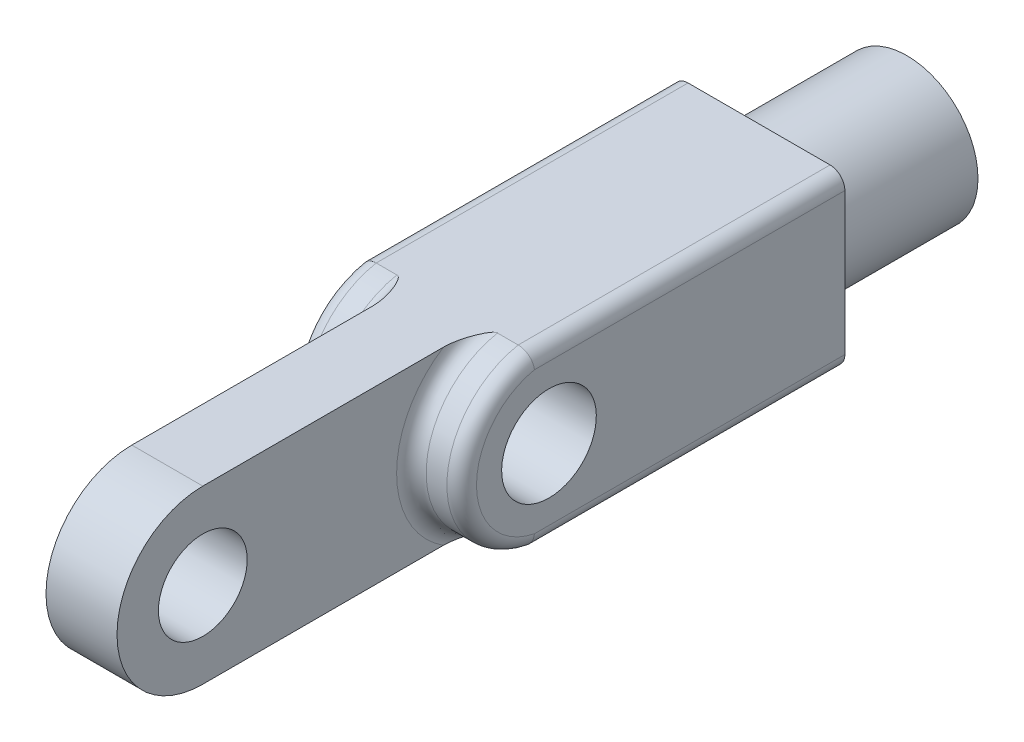
ISO-10303-21;
HEADER;
FILE_DESCRIPTION(('STEP AP214'),'2;1');
FILE_NAME('part.step','',(''),(''),'','','');
FILE_SCHEMA(('AUTOMOTIVE_DESIGN { 1 0 10303 214 1 1 1 1 }'));
ENDSEC;
DATA;
#1=APPLICATION_CONTEXT('core data for automotive mechanical design processes');
#2=APPLICATION_PROTOCOL_DEFINITION('international standard','automotive_design',2000,#1);
#3=PRODUCT_CONTEXT('',#1,'mechanical');
#4=PRODUCT('Part','Part','',(#3));
#5=PRODUCT_RELATED_PRODUCT_CATEGORY('part','',(#4));
#6=PRODUCT_DEFINITION_FORMATION('','',#4);
#7=PRODUCT_DEFINITION_CONTEXT('part definition',#1,'design');
#8=PRODUCT_DEFINITION('design','',#6,#7);
#9=PRODUCT_DEFINITION_SHAPE('','',#8);
#10=(LENGTH_UNIT() NAMED_UNIT(*) SI_UNIT(.MILLI.,.METRE.));
#11=(NAMED_UNIT(*) PLANE_ANGLE_UNIT() SI_UNIT($,.RADIAN.));
#12=(NAMED_UNIT(*) SI_UNIT($,.STERADIAN.) SOLID_ANGLE_UNIT());
#13=UNCERTAINTY_MEASURE_WITH_UNIT(LENGTH_MEASURE(1.E-05),#10,'distance_accuracy_value','');
#14=(GEOMETRIC_REPRESENTATION_CONTEXT(3) GLOBAL_UNCERTAINTY_ASSIGNED_CONTEXT((#13)) GLOBAL_UNIT_ASSIGNED_CONTEXT((#10,
#11,#12)) REPRESENTATION_CONTEXT('',''));
#15=CARTESIAN_POINT('',(0.,0.,0.));
#16=DIRECTION('',(0.,0.,1.));
#17=DIRECTION('',(1.,0.,0.));
#18=AXIS2_PLACEMENT_3D('',#15,#16,#17);
#19=CARTESIAN_POINT('',(2.9,-2.9,33.));
#20=DIRECTION('',(-1.,0.,0.));
#21=DIRECTION('',(0.,-1.,0.));
#22=AXIS2_PLACEMENT_3D('',#19,#20,#21);
#23=PLANE('',#22);
#24=CARTESIAN_POINT('',(2.9,0.,15.));
#25=DIRECTION('',(-1.,0.,0.));
#26=DIRECTION('',(0.,-1.,0.));
#27=AXIS2_PLACEMENT_3D('',#24,#25,#26);
#28=CIRCLE('',#27,1.6);
#29=CARTESIAN_POINT('',(2.9,-1.6,15.));
#30=VERTEX_POINT('',#29);
#31=EDGE_CURVE('E190',#30,#30,#28,.T.);
#32=ORIENTED_EDGE('',*,*,#31,.T.);
#33=EDGE_LOOP('',(#32));
#34=FACE_BOUND('',#33,.T.);
#35=DIRECTION('',(0.,1.,0.));
#36=VECTOR('',#35,1.);
#37=CARTESIAN_POINT('',(2.9,-2.9,5.));
#38=LINE('',#37,#36);
#39=CARTESIAN_POINT('',(2.9,-2.4,5.));
#40=VERTEX_POINT('',#39);
#41=CARTESIAN_POINT('',(2.9,2.4,5.));
#42=VERTEX_POINT('',#41);
#43=EDGE_CURVE('E199',#40,#42,#38,.T.);
#44=ORIENTED_EDGE('',*,*,#43,.T.);
#45=DIRECTION('',(0.,0.,-1.));
#46=VECTOR('',#45,1.);
#47=CARTESIAN_POINT('',(2.9,2.4,33.));
#48=LINE('',#47,#46);
#49=CARTESIAN_POINT('',(2.9,2.39999999999604,15.4924428901091));
#50=VERTEX_POINT('',#49);
#51=EDGE_CURVE('E219',#42,#50,#48,.F.);
#52=ORIENTED_EDGE('',*,*,#51,.T.);
#53=CARTESIAN_POINT('',(2.9,0.,15.));
#54=DIRECTION('',(-1.,0.,0.));
#55=DIRECTION('',(0.,-1.,0.));
#56=AXIS2_PLACEMENT_3D('',#53,#54,#55);
#57=CIRCLE('',#56,2.45);
#58=CARTESIAN_POINT('',(2.9,-2.4,15.4924428901091));
#59=VERTEX_POINT('',#58);
#60=EDGE_CURVE('E217',#50,#59,#57,.F.);
#61=ORIENTED_EDGE('',*,*,#60,.T.);
#62=DIRECTION('',(0.,0.,-1.));
#63=VECTOR('',#62,1.);
#64=CARTESIAN_POINT('',(2.9,-2.4,33.));
#65=LINE('',#64,#63);
#66=EDGE_CURVE('E215',#59,#40,#65,.T.);
#67=ORIENTED_EDGE('',*,*,#66,.T.);
#68=EDGE_LOOP('',(#44,#52,#61,#67));
#69=FACE_BOUND('',#68,.T.);
#70=ADVANCED_FACE('F36',(#34,#69),#23,.F.);
#71=CARTESIAN_POINT('',(-2.9,2.9,33.));
#72=DIRECTION('',(1.,0.,0.));
#73=DIRECTION('',(0.,1.,0.));
#74=AXIS2_PLACEMENT_3D('',#71,#72,#73);
#75=PLANE('',#74);
#76=CARTESIAN_POINT('',(-2.9,0.,15.));
#77=DIRECTION('',(-1.,0.,0.));
#78=DIRECTION('',(0.,-1.,0.));
#79=AXIS2_PLACEMENT_3D('',#76,#77,#78);
#80=CIRCLE('',#79,1.6);
#81=CARTESIAN_POINT('',(-2.9,-1.6,15.));
#82=VERTEX_POINT('',#81);
#83=EDGE_CURVE('E184',#82,#82,#80,.T.);
#84=ORIENTED_EDGE('',*,*,#83,.F.);
#85=EDGE_LOOP('',(#84));
#86=FACE_BOUND('',#85,.T.);
#87=CARTESIAN_POINT('',(-2.9,0.,15.));
#88=DIRECTION('',(1.,0.,0.));
#89=DIRECTION('',(0.,1.,0.));
#90=AXIS2_PLACEMENT_3D('',#87,#88,#89);
#91=CIRCLE('',#90,2.45);
#92=CARTESIAN_POINT('',(-2.9,-2.4,15.4924428901091));
#93=VERTEX_POINT('',#92);
#94=CARTESIAN_POINT('',(-2.9,2.39999999999604,15.4924428901091));
#95=VERTEX_POINT('',#94);
#96=EDGE_CURVE('E228',#93,#95,#91,.F.);
#97=ORIENTED_EDGE('',*,*,#96,.T.);
#98=DIRECTION('',(0.,0.,-1.));
#99=VECTOR('',#98,1.);
#100=CARTESIAN_POINT('',(-2.9,2.4,33.));
#101=LINE('',#100,#99);
#102=CARTESIAN_POINT('',(-2.9,2.4,5.));
#103=VERTEX_POINT('',#102);
#104=EDGE_CURVE('E230',#95,#103,#101,.T.);
#105=ORIENTED_EDGE('',*,*,#104,.T.);
#106=DIRECTION('',(0.,-1.,0.));
#107=VECTOR('',#106,1.);
#108=CARTESIAN_POINT('',(-2.9,2.9,5.));
#109=LINE('',#108,#107);
#110=CARTESIAN_POINT('',(-2.9,-2.4,5.));
#111=VERTEX_POINT('',#110);
#112=EDGE_CURVE('E194',#103,#111,#109,.T.);
#113=ORIENTED_EDGE('',*,*,#112,.T.);
#114=DIRECTION('',(0.,0.,-1.));
#115=VECTOR('',#114,1.);
#116=CARTESIAN_POINT('',(-2.9,-2.4,33.));
#117=LINE('',#116,#115);
#118=EDGE_CURVE('E226',#111,#93,#117,.F.);
#119=ORIENTED_EDGE('',*,*,#118,.T.);
#120=EDGE_LOOP('',(#97,#105,#113,#119));
#121=FACE_BOUND('',#120,.T.);
#122=ADVANCED_FACE('F323',(#86,#121),#75,.F.);
#123=CARTESIAN_POINT('',(-2.9,-2.9,33.));
#124=DIRECTION('',(0.,1.,0.));
#125=DIRECTION('',(-1.,0.,0.));
#126=AXIS2_PLACEMENT_3D('',#123,#124,#125);
#127=PLANE('',#126);
#128=DIRECTION('',(-1.,0.,0.));
#129=VECTOR('',#128,1.);
#130=CARTESIAN_POINT('',(5.09980188990753,-2.9,15.5408326913196));
#131=LINE('',#130,#129);
#132=CARTESIAN_POINT('',(-1.7,-2.9,15.5408326913196));
#133=VERTEX_POINT('',#132);
#134=CARTESIAN_POINT('',(-2.4,-2.9,15.5408326913196));
#135=VERTEX_POINT('',#134);
#136=EDGE_CURVE('E168',#133,#135,#131,.T.);
#137=ORIENTED_EDGE('',*,*,#136,.T.);
#138=DIRECTION('',(0.,0.,-1.));
#139=VECTOR('',#138,1.);
#140=CARTESIAN_POINT('',(-2.4,-2.9,33.));
#141=LINE('',#140,#139);
#142=CARTESIAN_POINT('',(-2.4,-2.9,5.));
#143=VERTEX_POINT('',#142);
#144=EDGE_CURVE('E67',#135,#143,#141,.T.);
#145=ORIENTED_EDGE('',*,*,#144,.T.);
#146=DIRECTION('',(1.,0.,0.));
#147=VECTOR('',#146,1.);
#148=CARTESIAN_POINT('',(-2.9,-2.9,5.));
#149=LINE('',#148,#147);
#150=CARTESIAN_POINT('',(2.4,-2.9,5.));
#151=VERTEX_POINT('',#150);
#152=EDGE_CURVE('E197',#143,#151,#149,.T.);
#153=ORIENTED_EDGE('',*,*,#152,.T.);
#154=DIRECTION('',(0.,0.,-1.));
#155=VECTOR('',#154,1.);
#156=CARTESIAN_POINT('',(2.4,-2.9,33.));
#157=LINE('',#156,#155);
#158=CARTESIAN_POINT('',(2.4,-2.9,15.5408326913196));
#159=VERTEX_POINT('',#158);
#160=EDGE_CURVE('E247',#151,#159,#157,.F.);
#161=ORIENTED_EDGE('',*,*,#160,.T.);
#162=DIRECTION('',(1.,0.,0.));
#163=VECTOR('',#162,1.);
#164=CARTESIAN_POINT('',(-5.09980188990753,-2.9,15.5408326913196));
#165=LINE('',#164,#163);
#166=CARTESIAN_POINT('',(1.7,-2.9,15.5408326913196));
#167=VERTEX_POINT('',#166);
#168=EDGE_CURVE('E300',#167,#159,#165,.T.);
#169=ORIENTED_EDGE('',*,*,#168,.F.);
#170=CARTESIAN_POINT('',(1.7,-2.9,15.5408326913196));
#171=CARTESIAN_POINT('',(1.69412480353315,-2.9,15.5408123998312));
#172=CARTESIAN_POINT('',(1.68827959778841,-2.9,15.5413967130348));
#173=CARTESIAN_POINT('',(1.67687295949634,-2.9,15.5435765291781));
#174=CARTESIAN_POINT('',(1.67130848875001,-2.9,15.5451557650231));
#175=CARTESIAN_POINT('',(1.65853087706052,-2.9,15.5498602747289));
#176=CARTESIAN_POINT('',(1.65145133483265,-2.9,15.5533384718661));
#177=CARTESIAN_POINT('',(1.63787459129956,-2.9,15.5613489450848));
#178=CARTESIAN_POINT('',(1.63138212101824,-2.9,15.5658888804982));
#179=CARTESIAN_POINT('',(1.6093968992353,-2.9,15.5830942904758));
#180=CARTESIAN_POINT('',(1.59534911027011,-2.9,15.597555191198));
#181=CARTESIAN_POINT('',(1.5692510588943,-2.9,15.6281635176408));
#182=CARTESIAN_POINT('',(1.55721456480454,-2.9,15.6443214258177));
#183=CARTESIAN_POINT('',(1.53470657491081,-2.9,15.6771578924549));
#184=CARTESIAN_POINT('',(1.52420562538351,-2.9,15.6938161448804));
#185=CARTESIAN_POINT('',(1.50408782173422,-2.9,15.7276621034289));
#186=CARTESIAN_POINT('',(1.49447165105841,-2.9,15.7448502053769));
#187=CARTESIAN_POINT('',(1.46658955764737,-2.9,15.7970164994017));
#188=CARTESIAN_POINT('',(1.44933095909224,-2.9,15.8325325368809));
#189=CARTESIAN_POINT('',(1.41667201070383,-2.9,15.9044578458938));
#190=CARTESIAN_POINT('',(1.4012746961101,-2.9,15.9408684629534));
#191=CARTESIAN_POINT('',(1.37210686809767,-2.9,16.0142907842692));
#192=CARTESIAN_POINT('',(1.35833473275119,-2.9,16.0513018465819));
#193=CARTESIAN_POINT('',(1.32320985813169,-2.9,16.1518801031893));
#194=CARTESIAN_POINT('',(1.30327688025274,-2.9,16.2159489878795));
#195=CARTESIAN_POINT('',(1.26798365493884,-2.9,16.3453462421695));
#196=CARTESIAN_POINT('',(1.25262412335833,-2.9,16.4106748072375));
#197=CARTESIAN_POINT('',(1.22744288173741,-2.9,16.5411169796033));
#198=CARTESIAN_POINT('',(1.21751987012134,-2.9,16.6062103346319));
#199=CARTESIAN_POINT('',(1.20723237351085,-2.9,16.7043629465234));
#200=CARTESIAN_POINT('',(1.20456916076688,-2.9,16.7371859339091));
#201=CARTESIAN_POINT('',(1.20095486025429,-2.9,16.8029424164482));
#202=CARTESIAN_POINT('',(1.20000470261831,-2.9,16.8358759619147));
#203=CARTESIAN_POINT('',(1.2,-2.9,16.8688231591031));
#204=B_SPLINE_CURVE_WITH_KNOTS('',3,(#170,#171,#172,#173,#174,#175,#176,#177,#178,#179,#180,
#181,#182,#183,#184,#185,#186,#187,#188,#189,#190,#191,#192,#193,#194,#195,#196,#197,#198,#199,
#200,#201,#202,#203),.UNSPECIFIED.,.F.,.F.,(4,2,2,2,2,2,2,2,2,2,2,2,2,2,2,2,4),(0.,
0.0175484885264491,0.0348172496168289,0.0583461930485622,0.0820504151958283,0.142059514112138,
0.202463923206587,0.261489398370771,0.320560091481372,0.438929011061277,0.557488425624699,
0.675928498953394,0.877051779021754,1.07820652319581,1.27547316760538,1.37422609435937,
1.47303262457768),.UNSPECIFIED.);
#205=CARTESIAN_POINT('',(1.2,-2.9,16.8688231591031));
#206=VERTEX_POINT('',#205);
#207=EDGE_CURVE('E11',#167,#206,#204,.T.);
#208=ORIENTED_EDGE('',*,*,#207,.T.);
#209=DIRECTION('',(0.,0.,1.));
#210=VECTOR('',#209,1.);
#211=CARTESIAN_POINT('',(1.2,-2.9,18.));
#212=LINE('',#211,#210);
#213=CARTESIAN_POINT('',(1.2,-2.9,25.));
#214=VERTEX_POINT('',#213);
#215=EDGE_CURVE('E157',#206,#214,#212,.T.);
#216=ORIENTED_EDGE('',*,*,#215,.T.);
#217=DIRECTION('',(-1.,0.,0.));
#218=VECTOR('',#217,1.);
#219=CARTESIAN_POINT('',(4.8,-2.9,25.));
#220=LINE('',#219,#218);
#221=CARTESIAN_POINT('',(-1.2,-2.9,25.));
#222=VERTEX_POINT('',#221);
#223=EDGE_CURVE('E164',#214,#222,#220,.T.);
#224=ORIENTED_EDGE('',*,*,#223,.T.);
#225=DIRECTION('',(0.,0.,1.));
#226=VECTOR('',#225,1.);
#227=CARTESIAN_POINT('',(-1.2,-2.9,18.));
#228=LINE('',#227,#226);
#229=CARTESIAN_POINT('',(-1.2,-2.9,16.8688231591031));
#230=VERTEX_POINT('',#229);
#231=EDGE_CURVE('E148',#230,#222,#228,.T.);
#232=ORIENTED_EDGE('',*,*,#231,.F.);
#233=CARTESIAN_POINT('',(-1.2,-2.9,16.8688231591031));
#234=CARTESIAN_POINT('',(-1.20000350633321,-2.9,16.8383114685506));
#235=CARTESIAN_POINT('',(-1.20081900974739,-2.9,16.8078103310561));
#236=CARTESIAN_POINT('',(-1.20393155246536,-2.9,16.7468963893262));
#237=CARTESIAN_POINT('',(-1.20622792431202,-2.9,16.7164835514926));
#238=CARTESIAN_POINT('',(-1.21511676156129,-2.9,16.6255319894845));
#239=CARTESIAN_POINT('',(-1.22370985461081,-2.9,16.5651844330548));
#240=CARTESIAN_POINT('',(-1.24532565481087,-2.9,16.4455946212641));
#241=CARTESIAN_POINT('',(-1.25832843113131,-2.9,16.3863486361891));
#242=CARTESIAN_POINT('',(-1.2881945004449,-2.9,16.2688307121859));
#243=CARTESIAN_POINT('',(-1.30505841144115,-2.9,16.21055893079));
#244=CARTESIAN_POINT('',(-1.33616838302538,-2.9,16.1143138929974));
#245=CARTESIAN_POINT('',(-1.34942774380135,-2.9,16.0760180856955));
#246=CARTESIAN_POINT('',(-1.37757918542265,-2.9,16.0000183022054));
#247=CARTESIAN_POINT('',(-1.39247171569656,-2.9,15.9623144922074));
#248=CARTESIAN_POINT('',(-1.43007136225979,-2.9,15.8733510625648));
#249=CARTESIAN_POINT('',(-1.45358760937016,-2.9,15.8224272524231));
#250=CARTESIAN_POINT('',(-1.49743401159934,-2.9,15.7387381757962));
#251=CARTESIAN_POINT('',(-1.51643227194485,-2.9,15.7053084151003));
#252=CARTESIAN_POINT('',(-1.54812107208784,-2.9,15.6572162375816));
#253=CARTESIAN_POINT('',(-1.55922491525228,-2.9,15.6415171869075));
#254=CARTESIAN_POINT('',(-1.58304930975357,-2.9,15.6113865379193));
#255=CARTESIAN_POINT('',(-1.59576410896297,-2.9,15.5969507247972));
#256=CARTESIAN_POINT('',(-1.6155148224544,-2.9,15.5786197386514));
#257=CARTESIAN_POINT('',(-1.62144510002131,-2.9,15.5735517538189));
#258=CARTESIAN_POINT('',(-1.63385574724301,-2.9,15.5641202261306));
#259=CARTESIAN_POINT('',(-1.64033597201689,-2.9,15.5597564986152));
#260=CARTESIAN_POINT('',(-1.65258384006708,-2.9,15.5528387757535));
#261=CARTESIAN_POINT('',(-1.65824398822566,-2.9,15.5500978111182));
#262=CARTESIAN_POINT('',(-1.66992606430478,-2.9,15.5455697112593));
#263=CARTESIAN_POINT('',(-1.67594647802512,-2.9,15.5437788583822));
#264=CARTESIAN_POINT('',(-1.6850250165976,-2.9,15.542007505823));
#265=CARTESIAN_POINT('',(-1.68799708364987,-2.9,15.5415698461755));
#266=CARTESIAN_POINT('',(-1.69397861410815,-2.9,15.5409812826071));
#267=CARTESIAN_POINT('',(-1.69698816492377,-2.9,15.5408312724835));
#268=CARTESIAN_POINT('',(-1.7000000000005,-2.9,15.5408326913222));
#269=B_SPLINE_CURVE_WITH_KNOTS('',3,(#233,#234,#235,#236,#237,#238,#239,#240,#241,#242,#243,
#244,#245,#246,#247,#248,#249,#250,#251,#252,#253,#254,#255,#256,#257,#258,#259,#260,#261,#262,
#263,#264,#265,#266,#267,#268),.UNSPECIFIED.,.F.,.F.,(4,2,2,2,2,2,2,2,2,2,2,2,2,2,2,2,2,4),(0.,
0.0915075016027789,0.182973787737792,0.365620096438801,0.547451647738752,0.729312322890625,
0.850858495871697,0.972438201230428,1.14055872870677,1.25569073762639,1.31333855375496,
1.37078604437942,1.39415453312701,1.4175168845579,1.43632308876769,1.45505515386331,
1.46405490944018,1.47308258442593),.UNSPECIFIED.);
#270=EDGE_CURVE('E250',#230,#133,#269,.T.);
#271=ORIENTED_EDGE('',*,*,#270,.T.);
#272=EDGE_LOOP('',(#137,#145,#153,#161,#169,#208,#216,#224,#232,#271));
#273=FACE_BOUND('',#272,.T.);
#274=ADVANCED_FACE('F170',(#273),#127,.F.);
#275=CARTESIAN_POINT('',(0.,0.,5.));
#276=DIRECTION('',(0.,0.,-1.));
#277=DIRECTION('',(-1.,0.,0.));
#278=AXIS2_PLACEMENT_3D('',#275,#276,#277);
#279=CYLINDRICAL_SURFACE('',#278,2.4);
#280=CARTESIAN_POINT('',(0.,0.,5.));
#281=DIRECTION('',(0.,0.,1.));
#282=DIRECTION('',(1.,0.,0.));
#283=AXIS2_PLACEMENT_3D('',#280,#281,#282);
#284=CIRCLE('',#283,2.4);
#285=CARTESIAN_POINT('',(2.4,0.,5.));
#286=VERTEX_POINT('',#285);
#287=EDGE_CURVE('E203',#286,#286,#284,.T.);
#288=ORIENTED_EDGE('',*,*,#287,.F.);
#289=EDGE_LOOP('',(#288));
#290=FACE_BOUND('',#289,.T.);
#291=CARTESIAN_POINT('',(0.,0.,0.));
#292=DIRECTION('',(0.,0.,1.));
#293=DIRECTION('',(1.,0.,0.));
#294=AXIS2_PLACEMENT_3D('',#291,#292,#293);
#295=CIRCLE('',#294,2.4);
#296=CARTESIAN_POINT('',(2.4,0.,0.));
#297=VERTEX_POINT('',#296);
#298=EDGE_CURVE('E202',#297,#297,#295,.T.);
#299=ORIENTED_EDGE('',*,*,#298,.T.);
#300=EDGE_LOOP('',(#299));
#301=FACE_BOUND('',#300,.T.);
#302=ADVANCED_FACE('F412',(#290,#301),#279,.T.);
#303=CARTESIAN_POINT('',(0.,0.,0.));
#304=DIRECTION('',(0.,0.,1.));
#305=DIRECTION('',(1.,0.,0.));
#306=AXIS2_PLACEMENT_3D('',#303,#304,#305);
#307=PLANE('',#306);
#308=ORIENTED_EDGE('',*,*,#298,.F.);
#309=EDGE_LOOP('',(#308));
#310=FACE_BOUND('',#309,.T.);
#311=ADVANCED_FACE('F408',(#310),#307,.F.);
#312=CARTESIAN_POINT('',(2.9,2.9,33.));
#313=DIRECTION('',(0.,-1.,0.));
#314=DIRECTION('',(1.,0.,0.));
#315=AXIS2_PLACEMENT_3D('',#312,#313,#314);
#316=PLANE('',#315);
#317=DIRECTION('',(1.,0.,0.));
#318=VECTOR('',#317,1.);
#319=CARTESIAN_POINT('',(-5.09980188990753,2.9,15.5408326913196));
#320=LINE('',#319,#318);
#321=CARTESIAN_POINT('',(1.7,2.9,15.5408326913196));
#322=VERTEX_POINT('',#321);
#323=CARTESIAN_POINT('',(2.4,2.9,15.5408326913196));
#324=VERTEX_POINT('',#323);
#325=EDGE_CURVE('E366',#322,#324,#320,.T.);
#326=ORIENTED_EDGE('',*,*,#325,.T.);
#327=DIRECTION('',(0.,0.,-1.));
#328=VECTOR('',#327,1.);
#329=CARTESIAN_POINT('',(2.4,2.9,33.));
#330=LINE('',#329,#328);
#331=CARTESIAN_POINT('',(2.4,2.9,5.));
#332=VERTEX_POINT('',#331);
#333=EDGE_CURVE('E238',#324,#332,#330,.T.);
#334=ORIENTED_EDGE('',*,*,#333,.T.);
#335=DIRECTION('',(-1.,0.,0.));
#336=VECTOR('',#335,1.);
#337=CARTESIAN_POINT('',(2.9,2.9,5.));
#338=LINE('',#337,#336);
#339=CARTESIAN_POINT('',(-2.4,2.9,5.));
#340=VERTEX_POINT('',#339);
#341=EDGE_CURVE('E191',#332,#340,#338,.T.);
#342=ORIENTED_EDGE('',*,*,#341,.T.);
#343=DIRECTION('',(0.,0.,-1.));
#344=VECTOR('',#343,1.);
#345=CARTESIAN_POINT('',(-2.4,2.9,33.));
#346=LINE('',#345,#344);
#347=CARTESIAN_POINT('',(-2.4,2.9,15.5408326913196));
#348=VERTEX_POINT('',#347);
#349=EDGE_CURVE('E236',#340,#348,#346,.F.);
#350=ORIENTED_EDGE('',*,*,#349,.T.);
#351=DIRECTION('',(-1.,0.,0.));
#352=VECTOR('',#351,1.);
#353=CARTESIAN_POINT('',(5.09980188990753,2.9,15.5408326913196));
#354=LINE('',#353,#352);
#355=CARTESIAN_POINT('',(-1.7,2.9,15.5408326913196));
#356=VERTEX_POINT('',#355);
#357=EDGE_CURVE('E359',#356,#348,#354,.T.);
#358=ORIENTED_EDGE('',*,*,#357,.F.);
#359=CARTESIAN_POINT('',(-1.7,2.9,15.5408326913196));
#360=CARTESIAN_POINT('',(-1.69412480353315,2.9,15.5408123998312));
#361=CARTESIAN_POINT('',(-1.68827959778841,2.9,15.5413967130348));
#362=CARTESIAN_POINT('',(-1.67687295949634,2.9,15.5435765291781));
#363=CARTESIAN_POINT('',(-1.67130848875001,2.9,15.545155765023));
#364=CARTESIAN_POINT('',(-1.65853087706052,2.9,15.5498602747288));
#365=CARTESIAN_POINT('',(-1.65145133483266,2.9,15.5533384718661));
#366=CARTESIAN_POINT('',(-1.63787459129956,2.9,15.5613489450848));
#367=CARTESIAN_POINT('',(-1.63138212101824,2.9,15.5658888804982));
#368=CARTESIAN_POINT('',(-1.60939689923531,2.9,15.5830942904758));
#369=CARTESIAN_POINT('',(-1.59534911027012,2.9,15.597555191198));
#370=CARTESIAN_POINT('',(-1.5692510588943,2.9,15.6281635176408));
#371=CARTESIAN_POINT('',(-1.55721456480455,2.9,15.6443214258177));
#372=CARTESIAN_POINT('',(-1.53470657491081,2.9,15.6771578924548));
#373=CARTESIAN_POINT('',(-1.52420562538351,2.9,15.6938161448804));
#374=CARTESIAN_POINT('',(-1.50408782173422,2.9,15.7276621034289));
#375=CARTESIAN_POINT('',(-1.49447165105842,2.9,15.7448502053769));
#376=CARTESIAN_POINT('',(-1.46658955764737,2.9,15.7970164994016));
#377=CARTESIAN_POINT('',(-1.44933095909224,2.9,15.8325325368809));
#378=CARTESIAN_POINT('',(-1.41667201070384,2.9,15.9044578458938));
#379=CARTESIAN_POINT('',(-1.4012746961101,2.9,15.9408684629534));
#380=CARTESIAN_POINT('',(-1.37210686809767,2.9,16.0142907842691));
#381=CARTESIAN_POINT('',(-1.3583347327512,2.9,16.0513018465819));
#382=CARTESIAN_POINT('',(-1.3232098581317,2.9,16.1518801031893));
#383=CARTESIAN_POINT('',(-1.30327688025274,2.9,16.2159489878795));
#384=CARTESIAN_POINT('',(-1.26798365493885,2.9,16.3453462421695));
#385=CARTESIAN_POINT('',(-1.25262412335834,2.9,16.4106748072375));
#386=CARTESIAN_POINT('',(-1.22744288173741,2.9,16.5411169796033));
#387=CARTESIAN_POINT('',(-1.21751987012134,2.9,16.6062103346319));
#388=CARTESIAN_POINT('',(-1.20723237351085,2.9,16.7043629465233));
#389=CARTESIAN_POINT('',(-1.20456916076688,2.9,16.7371859339091));
#390=CARTESIAN_POINT('',(-1.2009548602543,2.9,16.8029424164482));
#391=CARTESIAN_POINT('',(-1.20000470261831,2.9,16.8358759619147));
#392=CARTESIAN_POINT('',(-1.2,2.9,16.8688231591031));
#393=B_SPLINE_CURVE_WITH_KNOTS('',3,(#359,#360,#361,#362,#363,#364,#365,#366,#367,#368,#369,
#370,#371,#372,#373,#374,#375,#376,#377,#378,#379,#380,#381,#382,#383,#384,#385,#386,#387,#388,
#389,#390,#391,#392),.UNSPECIFIED.,.F.,.F.,(4,2,2,2,2,2,2,2,2,2,2,2,2,2,2,2,4),(0.,
0.0175484885264489,0.0348172496168292,0.0583461930485607,0.0820504151958249,0.142059514112133,
0.202463923206581,0.261489398370768,0.32056009148137,0.438929011061271,0.557488425624689,
0.675928498953376,0.877051779021737,1.07820652319579,1.27547316760537,1.37422609435937,
1.47303262457769),.UNSPECIFIED.);
#394=CARTESIAN_POINT('',(-1.2,2.9,16.8688231591031));
#395=VERTEX_POINT('',#394);
#396=EDGE_CURVE('E257',#356,#395,#393,.T.);
#397=ORIENTED_EDGE('',*,*,#396,.T.);
#398=DIRECTION('',(0.,0.,1.));
#399=VECTOR('',#398,1.);
#400=CARTESIAN_POINT('',(-1.2,2.9,18.));
#401=LINE('',#400,#399);
#402=CARTESIAN_POINT('',(-1.2,2.9,25.));
#403=VERTEX_POINT('',#402);
#404=EDGE_CURVE('E156',#395,#403,#401,.T.);
#405=ORIENTED_EDGE('',*,*,#404,.T.);
#406=DIRECTION('',(-1.,0.,0.));
#407=VECTOR('',#406,1.);
#408=CARTESIAN_POINT('',(4.8,2.9,25.));
#409=LINE('',#408,#407);
#410=CARTESIAN_POINT('',(1.2,2.9,25.));
#411=VERTEX_POINT('',#410);
#412=EDGE_CURVE('E167',#411,#403,#409,.T.);
#413=ORIENTED_EDGE('',*,*,#412,.F.);
#414=DIRECTION('',(0.,0.,1.));
#415=VECTOR('',#414,1.);
#416=CARTESIAN_POINT('',(1.2,2.9,18.));
#417=LINE('',#416,#415);
#418=CARTESIAN_POINT('',(1.2,2.9,16.8688231591031));
#419=VERTEX_POINT('',#418);
#420=EDGE_CURVE('E183',#419,#411,#417,.T.);
#421=ORIENTED_EDGE('',*,*,#420,.F.);
#422=CARTESIAN_POINT('',(1.2,2.9,16.8688231591031));
#423=CARTESIAN_POINT('',(1.20000350633322,2.9,16.8383114685506));
#424=CARTESIAN_POINT('',(1.20081900974739,2.9,16.8078103310561));
#425=CARTESIAN_POINT('',(1.20393155246536,2.9,16.7468963893262));
#426=CARTESIAN_POINT('',(1.20622792431202,2.9,16.7164835514926));
#427=CARTESIAN_POINT('',(1.21511676156129,2.9,16.6255319894845));
#428=CARTESIAN_POINT('',(1.22370985461082,2.9,16.5651844330548));
#429=CARTESIAN_POINT('',(1.24532565481087,2.9,16.4455946212641));
#430=CARTESIAN_POINT('',(1.25832843113131,2.9,16.3863486361891));
#431=CARTESIAN_POINT('',(1.2881945004449,2.9,16.2688307121859));
#432=CARTESIAN_POINT('',(1.30505841144115,2.9,16.21055893079));
#433=CARTESIAN_POINT('',(1.33616838302538,2.9,16.1143138929974));
#434=CARTESIAN_POINT('',(1.34942774380135,2.9,16.0760180856955));
#435=CARTESIAN_POINT('',(1.37757918542265,2.9,16.0000183022054));
#436=CARTESIAN_POINT('',(1.39247171569655,2.9,15.9623144922074));
#437=CARTESIAN_POINT('',(1.43007136225978,2.9,15.8733510625648));
#438=CARTESIAN_POINT('',(1.45358760937015,2.9,15.8224272524231));
#439=CARTESIAN_POINT('',(1.49743401159933,2.9,15.7387381757962));
#440=CARTESIAN_POINT('',(1.51643227194484,2.9,15.7053084151003));
#441=CARTESIAN_POINT('',(1.54812107208783,2.9,15.6572162375816));
#442=CARTESIAN_POINT('',(1.55922491525227,2.9,15.6415171869075));
#443=CARTESIAN_POINT('',(1.58304930975356,2.9,15.6113865379193));
#444=CARTESIAN_POINT('',(1.59576410896296,2.9,15.5969507247972));
#445=CARTESIAN_POINT('',(1.61551482245439,2.9,15.5786197386514));
#446=CARTESIAN_POINT('',(1.62144510002129,2.9,15.5735517538189));
#447=CARTESIAN_POINT('',(1.633855747243,2.9,15.5641202261306));
#448=CARTESIAN_POINT('',(1.64033597201688,2.9,15.5597564986152));
#449=CARTESIAN_POINT('',(1.65258384006707,2.9,15.5528387757535));
#450=CARTESIAN_POINT('',(1.65824398822565,2.9,15.5500978111182));
#451=CARTESIAN_POINT('',(1.66992606430477,2.9,15.5455697112593));
#452=CARTESIAN_POINT('',(1.67594647802511,2.9,15.5437788583822));
#453=CARTESIAN_POINT('',(1.68502501659759,2.9,15.542007505823));
#454=CARTESIAN_POINT('',(1.68799708364987,2.9,15.5415698461754));
#455=CARTESIAN_POINT('',(1.69397861410815,2.9,15.5409812826071));
#456=CARTESIAN_POINT('',(1.69698816492377,2.9,15.5408312724835));
#457=CARTESIAN_POINT('',(1.70000000000051,2.9,15.5408326913222));
#458=B_SPLINE_CURVE_WITH_KNOTS('',3,(#422,#423,#424,#425,#426,#427,#428,#429,#430,#431,#432,
#433,#434,#435,#436,#437,#438,#439,#440,#441,#442,#443,#444,#445,#446,#447,#448,#449,#450,#451,
#452,#453,#454,#455,#456,#457),.UNSPECIFIED.,.F.,.F.,(4,2,2,2,2,2,2,2,2,2,2,2,2,2,2,2,2,4),(0.,
0.0915075016027789,0.182973787737792,0.365620096438797,0.547451647738748,0.729312322890625,
0.85085849587169,0.972438201230405,1.14055872870675,1.25569073762638,1.31333855375494,
1.3707860443794,1.394154533127,1.41751688455789,1.43632308876768,1.45505515386331,
1.46405490944018,1.47308258442594),.UNSPECIFIED.);
#459=EDGE_CURVE('E52',#419,#322,#458,.T.);
#460=ORIENTED_EDGE('',*,*,#459,.T.);
#461=EDGE_LOOP('',(#326,#334,#342,#350,#358,#397,#405,#413,#421,#460));
#462=FACE_BOUND('',#461,.T.);
#463=ADVANCED_FACE('F335',(#462),#316,.F.);
#464=CARTESIAN_POINT('',(0.,0.,5.));
#465=DIRECTION('',(0.,0.,1.));
#466=DIRECTION('',(1.,0.,0.));
#467=AXIS2_PLACEMENT_3D('',#464,#465,#466);
#468=PLANE('',#467);
#469=ORIENTED_EDGE('',*,*,#287,.T.);
#470=EDGE_LOOP('',(#469));
#471=FACE_BOUND('',#470,.T.);
#472=ORIENTED_EDGE('',*,*,#341,.F.);
#473=CARTESIAN_POINT('',(2.4,2.4,5.));
#474=DIRECTION('',(0.,0.,1.));
#475=DIRECTION('',(1.,0.,0.));
#476=AXIS2_PLACEMENT_3D('',#473,#474,#475);
#477=CIRCLE('',#476,0.5);
#478=EDGE_CURVE('E245',#332,#42,#477,.F.);
#479=ORIENTED_EDGE('',*,*,#478,.T.);
#480=ORIENTED_EDGE('',*,*,#43,.F.);
#481=CARTESIAN_POINT('',(2.4,-2.4,5.));
#482=DIRECTION('',(0.,0.,1.));
#483=DIRECTION('',(1.,0.,0.));
#484=AXIS2_PLACEMENT_3D('',#481,#482,#483);
#485=CIRCLE('',#484,0.5);
#486=EDGE_CURVE('E60',#40,#151,#485,.F.);
#487=ORIENTED_EDGE('',*,*,#486,.T.);
#488=ORIENTED_EDGE('',*,*,#152,.F.);
#489=CARTESIAN_POINT('',(-2.4,-2.4,5.));
#490=DIRECTION('',(0.,0.,1.));
#491=DIRECTION('',(1.,0.,0.));
#492=AXIS2_PLACEMENT_3D('',#489,#490,#491);
#493=CIRCLE('',#492,0.5);
#494=EDGE_CURVE('E241',#143,#111,#493,.F.);
#495=ORIENTED_EDGE('',*,*,#494,.T.);
#496=ORIENTED_EDGE('',*,*,#112,.F.);
#497=CARTESIAN_POINT('',(-2.4,2.4,5.));
#498=DIRECTION('',(0.,0.,1.));
#499=DIRECTION('',(1.,0.,0.));
#500=AXIS2_PLACEMENT_3D('',#497,#498,#499);
#501=CIRCLE('',#500,0.5);
#502=EDGE_CURVE('E243',#103,#340,#501,.F.);
#503=ORIENTED_EDGE('',*,*,#502,.T.);
#504=EDGE_LOOP('',(#472,#479,#480,#487,#488,#495,#496,#503));
#505=FACE_BOUND('',#504,.T.);
#506=ADVANCED_FACE('F331',(#471,#505),#468,.F.);
#507=CARTESIAN_POINT('',(7.1,0.,15.));
#508=DIRECTION('',(-1.,0.,0.));
#509=DIRECTION('',(0.,-1.,0.));
#510=AXIS2_PLACEMENT_3D('',#507,#508,#509);
#511=CYLINDRICAL_SURFACE('',#510,1.6);
#512=ORIENTED_EDGE('',*,*,#83,.T.);
#513=EDGE_LOOP('',(#512));
#514=FACE_BOUND('',#513,.T.);
#515=ORIENTED_EDGE('',*,*,#31,.F.);
#516=EDGE_LOOP('',(#515));
#517=FACE_BOUND('',#516,.T.);
#518=ADVANCED_FACE('F334',(#514,#517),#511,.F.);
#519=CARTESIAN_POINT('',(1.2,2.9,18.));
#520=DIRECTION('',(-1.,0.,0.));
#521=DIRECTION('',(0.,0.,1.));
#522=AXIS2_PLACEMENT_3D('',#519,#520,#521);
#523=PLANE('',#522);
#524=CARTESIAN_POINT('',(1.2,0.,25.));
#525=DIRECTION('',(-1.,0.,0.));
#526=DIRECTION('',(0.,0.,1.));
#527=AXIS2_PLACEMENT_3D('',#524,#525,#526);
#528=CIRCLE('',#527,1.5);
#529=CARTESIAN_POINT('',(1.2,0.,26.5));
#530=VERTEX_POINT('',#529);
#531=EDGE_CURVE('E178',#530,#530,#528,.T.);
#532=ORIENTED_EDGE('',*,*,#531,.T.);
#533=EDGE_LOOP('',(#532));
#534=FACE_BOUND('',#533,.T.);
#535=ORIENTED_EDGE('',*,*,#215,.F.);
#536=CARTESIAN_POINT('',(1.2,0.,15.));
#537=DIRECTION('',(-1.,0.,0.));
#538=DIRECTION('',(0.,0.,1.));
#539=AXIS2_PLACEMENT_3D('',#536,#537,#538);
#540=CIRCLE('',#539,3.45);
#541=EDGE_CURVE('E233',#206,#419,#540,.T.);
#542=ORIENTED_EDGE('',*,*,#541,.T.);
#543=ORIENTED_EDGE('',*,*,#420,.T.);
#544=CARTESIAN_POINT('',(1.2,0.,25.));
#545=DIRECTION('',(-1.,0.,0.));
#546=DIRECTION('',(0.,0.,1.));
#547=AXIS2_PLACEMENT_3D('',#544,#545,#546);
#548=CIRCLE('',#547,2.9);
#549=EDGE_CURVE('E181',#411,#214,#548,.F.);
#550=ORIENTED_EDGE('',*,*,#549,.T.);
#551=EDGE_LOOP('',(#535,#542,#543,#550));
#552=FACE_BOUND('',#551,.T.);
#553=ADVANCED_FACE('F339',(#534,#552),#523,.F.);
#554=CARTESIAN_POINT('',(-1.2,2.9,18.));
#555=DIRECTION('',(1.,0.,0.));
#556=DIRECTION('',(0.,1.,0.));
#557=AXIS2_PLACEMENT_3D('',#554,#555,#556);
#558=PLANE('',#557);
#559=CARTESIAN_POINT('',(-1.2,0.,25.));
#560=DIRECTION('',(-1.,0.,0.));
#561=DIRECTION('',(0.,-1.,0.));
#562=AXIS2_PLACEMENT_3D('',#559,#560,#561);
#563=CIRCLE('',#562,1.5);
#564=CARTESIAN_POINT('',(-1.2,-1.5,25.));
#565=VERTEX_POINT('',#564);
#566=EDGE_CURVE('E173',#565,#565,#563,.T.);
#567=ORIENTED_EDGE('',*,*,#566,.F.);
#568=EDGE_LOOP('',(#567));
#569=FACE_BOUND('',#568,.T.);
#570=ORIENTED_EDGE('',*,*,#404,.F.);
#571=CARTESIAN_POINT('',(-1.2,0.,15.));
#572=DIRECTION('',(1.,0.,0.));
#573=DIRECTION('',(0.,1.,0.));
#574=AXIS2_PLACEMENT_3D('',#571,#572,#573);
#575=CIRCLE('',#574,3.45);
#576=EDGE_CURVE('E154',#395,#230,#575,.T.);
#577=ORIENTED_EDGE('',*,*,#576,.T.);
#578=ORIENTED_EDGE('',*,*,#231,.T.);
#579=CARTESIAN_POINT('',(-1.2,0.,25.));
#580=DIRECTION('',(1.,0.,0.));
#581=DIRECTION('',(0.,1.,0.));
#582=AXIS2_PLACEMENT_3D('',#579,#580,#581);
#583=CIRCLE('',#582,2.9);
#584=EDGE_CURVE('E152',#403,#222,#583,.T.);
#585=ORIENTED_EDGE('',*,*,#584,.F.);
#586=EDGE_LOOP('',(#570,#577,#578,#585));
#587=FACE_BOUND('',#586,.T.);
#588=ADVANCED_FACE('F151',(#569,#587),#558,.F.);
#589=CARTESIAN_POINT('',(4.8,0.,25.));
#590=DIRECTION('',(-1.,0.,0.));
#591=DIRECTION('',(0.,-1.,0.));
#592=AXIS2_PLACEMENT_3D('',#589,#590,#591);
#593=CYLINDRICAL_SURFACE('',#592,1.5);
#594=ORIENTED_EDGE('',*,*,#566,.T.);
#595=EDGE_LOOP('',(#594));
#596=FACE_BOUND('',#595,.T.);
#597=ORIENTED_EDGE('',*,*,#531,.F.);
#598=EDGE_LOOP('',(#597));
#599=FACE_BOUND('',#598,.T.);
#600=ADVANCED_FACE('F346',(#596,#599),#593,.F.);
#601=CARTESIAN_POINT('',(4.8,0.,25.));
#602=DIRECTION('',(-1.,0.,0.));
#603=DIRECTION('',(0.,-1.,0.));
#604=AXIS2_PLACEMENT_3D('',#601,#602,#603);
#605=CYLINDRICAL_SURFACE('',#604,2.9);
#606=ORIENTED_EDGE('',*,*,#412,.T.);
#607=ORIENTED_EDGE('',*,*,#584,.T.);
#608=ORIENTED_EDGE('',*,*,#223,.F.);
#609=ORIENTED_EDGE('',*,*,#549,.F.);
#610=EDGE_LOOP('',(#606,#607,#608,#609));
#611=FACE_BOUND('',#610,.T.);
#612=ADVANCED_FACE('F162',(#611),#605,.T.);
#613=CARTESIAN_POINT('',(5.09980188990753,0.,15.));
#614=DIRECTION('',(-1.,0.,0.));
#615=DIRECTION('',(0.,-1.,0.));
#616=AXIS2_PLACEMENT_3D('',#613,#614,#615);
#617=CYLINDRICAL_SURFACE('',#616,2.95);
#618=ORIENTED_EDGE('',*,*,#357,.T.);
#619=CARTESIAN_POINT('',(-2.4,0.,15.));
#620=DIRECTION('',(1.,0.,0.));
#621=DIRECTION('',(0.,1.,0.));
#622=AXIS2_PLACEMENT_3D('',#619,#620,#621);
#623=CIRCLE('',#622,2.95);
#624=EDGE_CURVE('E223',#348,#135,#623,.T.);
#625=ORIENTED_EDGE('',*,*,#624,.T.);
#626=ORIENTED_EDGE('',*,*,#136,.F.);
#627=CARTESIAN_POINT('',(-1.7,0.,15.));
#628=DIRECTION('',(1.,0.,0.));
#629=DIRECTION('',(0.,1.,0.));
#630=AXIS2_PLACEMENT_3D('',#627,#628,#629);
#631=CIRCLE('',#630,2.95);
#632=EDGE_CURVE('E221',#133,#356,#631,.F.);
#633=ORIENTED_EDGE('',*,*,#632,.T.);
#634=EDGE_LOOP('',(#618,#625,#626,#633));
#635=FACE_BOUND('',#634,.T.);
#636=ADVANCED_FACE('F319',(#635),#617,.T.);
#637=CARTESIAN_POINT('',(-5.09980188990753,0.,15.));
#638=DIRECTION('',(1.,0.,0.));
#639=DIRECTION('',(0.,1.,0.));
#640=AXIS2_PLACEMENT_3D('',#637,#638,#639);
#641=CYLINDRICAL_SURFACE('',#640,2.95);
#642=ORIENTED_EDGE('',*,*,#168,.T.);
#643=CARTESIAN_POINT('',(2.4,0.,15.));
#644=DIRECTION('',(-1.,0.,0.));
#645=DIRECTION('',(0.,-1.,0.));
#646=AXIS2_PLACEMENT_3D('',#643,#644,#645);
#647=CIRCLE('',#646,2.95);
#648=EDGE_CURVE('E212',#159,#324,#647,.T.);
#649=ORIENTED_EDGE('',*,*,#648,.T.);
#650=ORIENTED_EDGE('',*,*,#325,.F.);
#651=CARTESIAN_POINT('',(1.7,0.,15.));
#652=DIRECTION('',(-1.,0.,0.));
#653=DIRECTION('',(0.,0.,1.));
#654=AXIS2_PLACEMENT_3D('',#651,#652,#653);
#655=CIRCLE('',#654,2.95);
#656=EDGE_CURVE('E206',#322,#167,#655,.F.);
#657=ORIENTED_EDGE('',*,*,#656,.T.);
#658=EDGE_LOOP('',(#642,#649,#650,#657));
#659=FACE_BOUND('',#658,.T.);
#660=ADVANCED_FACE('F312',(#659),#641,.T.);
#661=CARTESIAN_POINT('',(2.4,-2.4,33.));
#662=DIRECTION('',(0.,0.,-1.));
#663=DIRECTION('',(-1.,0.,0.));
#664=AXIS2_PLACEMENT_3D('',#661,#662,#663);
#665=CYLINDRICAL_SURFACE('',#664,0.5);
#666=ORIENTED_EDGE('',*,*,#486,.F.);
#667=ORIENTED_EDGE('',*,*,#66,.F.);
#668=CARTESIAN_POINT('',(2.4,-2.9,15.5408326913196));
#669=CARTESIAN_POINT('',(2.42803940677333,-2.90002429743253,15.5408344015908));
#670=CARTESIAN_POINT('',(2.45607102732957,-2.89764284952745,15.5406147617355));
#671=CARTESIAN_POINT('',(2.51131739381744,-2.88824818298713,15.5397454594815));
#672=CARTESIAN_POINT('',(2.53853279932399,-2.88123881565778,15.5390961546446));
#673=CARTESIAN_POINT('',(2.59140624034548,-2.86276342575732,15.5373797848184));
#674=CARTESIAN_POINT('',(2.61706358640882,-2.85129544659855,15.53631253642));
#675=CARTESIAN_POINT('',(2.66608002042106,-2.82424567487831,15.5337847603166));
#676=CARTESIAN_POINT('',(2.68943958384697,-2.80866473587451,15.53232431421));
#677=CARTESIAN_POINT('',(2.7332497965983,-2.77380439344825,15.5290398202131));
#678=CARTESIAN_POINT('',(2.75369537518013,-2.75451867682912,15.5272151514516));
#679=CARTESIAN_POINT('',(2.7910670505784,-2.71281102367436,15.5232447193172));
#680=CARTESIAN_POINT('',(2.80799190641161,-2.69038798593909,15.5210988431821));
#681=CARTESIAN_POINT('',(2.83791091976851,-2.6429490810713,15.5165270110999));
#682=CARTESIAN_POINT('',(2.85088770382892,-2.61792238609086,15.5140998803176));
#683=CARTESIAN_POINT('',(2.87244588416291,-2.56607642594659,15.5090324485885));
#684=CARTESIAN_POINT('',(2.88103109892779,-2.53925874107803,15.506392335152));
#685=CARTESIAN_POINT('',(2.89115608634814,-2.49519462447726,15.5020181718058));
#686=CARTESIAN_POINT('',(2.89413661267071,-2.47825964463107,15.5003287877939));
#687=CARTESIAN_POINT('',(2.89833772894004,-2.44419313660815,15.4969126856132));
#688=CARTESIAN_POINT('',(2.89956094074367,-2.4270619397562,15.4951860269723));
#689=CARTESIAN_POINT('',(2.89996723775333,-2.40661615542502,15.4931143168391));
#690=CARTESIAN_POINT('',(2.90000008768334,-2.4033078241481,15.4927787509489));
#691=CARTESIAN_POINT('',(2.9,-2.4,15.4924428900898));
#692=B_SPLINE_CURVE_WITH_KNOTS('',3,(#668,#669,#670,#671,#672,#673,#674,#675,#676,#677,#678,
#679,#680,#681,#682,#683,#684,#685,#686,#687,#688,#689,#690,#691),.UNSPECIFIED.,.F.,.F.,(4,2,2,
2,2,2,2,2,2,2,2,4),(0.,0.0840051351291551,0.167940450033359,0.251912640205417,0.335867417410393,
0.419966549210534,0.504095274204288,0.588589023840735,0.673009180324539,0.724765764053839,
0.776445048141009,0.786420699876426),.UNSPECIFIED.);
#693=EDGE_CURVE('E292',#159,#59,#692,.T.);
#694=ORIENTED_EDGE('',*,*,#693,.F.);
#695=ORIENTED_EDGE('',*,*,#160,.F.);
#696=EDGE_LOOP('',(#666,#667,#694,#695));
#697=FACE_BOUND('',#696,.T.);
#698=ADVANCED_FACE('F308',(#697),#665,.T.);
#699=CARTESIAN_POINT('',(2.4,2.4,33.));
#700=DIRECTION('',(0.,0.,-1.));
#701=DIRECTION('',(-1.,0.,0.));
#702=AXIS2_PLACEMENT_3D('',#699,#700,#701);
#703=CYLINDRICAL_SURFACE('',#702,0.5);
#704=ORIENTED_EDGE('',*,*,#478,.F.);
#705=ORIENTED_EDGE('',*,*,#333,.F.);
#706=CARTESIAN_POINT('',(2.4,2.9,15.5408326913196));
#707=CARTESIAN_POINT('',(2.42803940677333,2.90002429743254,15.5408344015908));
#708=CARTESIAN_POINT('',(2.45607102732957,2.89764284952745,15.5406147617355));
#709=CARTESIAN_POINT('',(2.51131739381744,2.88824818298713,15.5397454594815));
#710=CARTESIAN_POINT('',(2.53853279932399,2.88123881565778,15.5390961546446));
#711=CARTESIAN_POINT('',(2.59140624034547,2.86276342575732,15.5373797848183));
#712=CARTESIAN_POINT('',(2.61706358640882,2.85129544659855,15.53631253642));
#713=CARTESIAN_POINT('',(2.66608002042106,2.82424567487831,15.5337847603166));
#714=CARTESIAN_POINT('',(2.68943958384697,2.80866473587451,15.53232431421));
#715=CARTESIAN_POINT('',(2.7332497965983,2.77380439344825,15.529039820213));
#716=CARTESIAN_POINT('',(2.75369537518013,2.75451867682913,15.5272151514515));
#717=CARTESIAN_POINT('',(2.7910670505784,2.71281102367437,15.5232447193172));
#718=CARTESIAN_POINT('',(2.80799190641161,2.69038798593909,15.5210988431821));
#719=CARTESIAN_POINT('',(2.83791091976851,2.6429490810713,15.5165270110999));
#720=CARTESIAN_POINT('',(2.85088770382892,2.61792238609086,15.5140998803176));
#721=CARTESIAN_POINT('',(2.87244588416291,2.56607642594659,15.5090324485885));
#722=CARTESIAN_POINT('',(2.88103109892779,2.53925874107803,15.506392335152));
#723=CARTESIAN_POINT('',(2.89115608634814,2.49519462447726,15.5020181718058));
#724=CARTESIAN_POINT('',(2.8941366126707,2.47825964463107,15.5003287877939));
#725=CARTESIAN_POINT('',(2.89833772894004,2.44419313660815,15.4969126856132));
#726=CARTESIAN_POINT('',(2.89956094074366,2.4270619397562,15.4951860269723));
#727=CARTESIAN_POINT('',(2.89996723775333,2.40661615542502,15.4931143168391));
#728=CARTESIAN_POINT('',(2.90000008768334,2.4033078241481,15.4927787509489));
#729=CARTESIAN_POINT('',(2.9,2.4,15.4924428900898));
#730=B_SPLINE_CURVE_WITH_KNOTS('',3,(#706,#707,#708,#709,#710,#711,#712,#713,#714,#715,#716,
#717,#718,#719,#720,#721,#722,#723,#724,#725,#726,#727,#728,#729),.UNSPECIFIED.,.F.,.F.,(4,2,2,
2,2,2,2,2,2,2,2,4),(0.,0.0840051351291556,0.167940450033359,0.251912640205417,0.335867417410393,
0.419966549210534,0.504095274204288,0.588589023840736,0.67300918032454,0.72476576405384,
0.776445048141009,0.786420699876426),.UNSPECIFIED.);
#731=EDGE_CURVE('E301',#50,#324,#730,.F.);
#732=ORIENTED_EDGE('',*,*,#731,.F.);
#733=ORIENTED_EDGE('',*,*,#51,.F.);
#734=EDGE_LOOP('',(#704,#705,#732,#733));
#735=FACE_BOUND('',#734,.T.);
#736=ADVANCED_FACE('F311',(#735),#703,.T.);
#737=CARTESIAN_POINT('',(2.4,0.,15.));
#738=DIRECTION('',(-1.,0.,0.));
#739=DIRECTION('',(0.,-1.,0.));
#740=AXIS2_PLACEMENT_3D('',#737,#738,#739);
#741=TOROIDAL_SURFACE('',#740,2.45,0.5);
#742=ORIENTED_EDGE('',*,*,#693,.T.);
#743=ORIENTED_EDGE('',*,*,#60,.F.);
#744=ORIENTED_EDGE('',*,*,#731,.T.);
#745=ORIENTED_EDGE('',*,*,#648,.F.);
#746=EDGE_LOOP('',(#742,#743,#744,#745));
#747=FACE_BOUND('',#746,.T.);
#748=ADVANCED_FACE('F277',(#747),#741,.T.);
#749=CARTESIAN_POINT('',(-2.4,2.4,33.));
#750=DIRECTION('',(0.,0.,-1.));
#751=DIRECTION('',(-1.,0.,0.));
#752=AXIS2_PLACEMENT_3D('',#749,#750,#751);
#753=CYLINDRICAL_SURFACE('',#752,0.5);
#754=ORIENTED_EDGE('',*,*,#502,.F.);
#755=ORIENTED_EDGE('',*,*,#104,.F.);
#756=CARTESIAN_POINT('',(-2.4,2.9,15.5408326913196));
#757=CARTESIAN_POINT('',(-2.42803940677333,2.90002429743254,15.5408344015908));
#758=CARTESIAN_POINT('',(-2.45607102732957,2.89764284952745,15.5406147617355));
#759=CARTESIAN_POINT('',(-2.51131739381744,2.88824818298713,15.5397454594815));
#760=CARTESIAN_POINT('',(-2.53853279932399,2.88123881565778,15.5390961546446));
#761=CARTESIAN_POINT('',(-2.59140624034548,2.86276342575732,15.5373797848183));
#762=CARTESIAN_POINT('',(-2.61706358640883,2.85129544659856,15.53631253642));
#763=CARTESIAN_POINT('',(-2.66608002042106,2.82424567487831,15.5337847603166));
#764=CARTESIAN_POINT('',(-2.68943958384697,2.80866473587451,15.53232431421));
#765=CARTESIAN_POINT('',(-2.73324979659831,2.77380439344825,15.529039820213));
#766=CARTESIAN_POINT('',(-2.75369537518013,2.75451867682913,15.5272151514515));
#767=CARTESIAN_POINT('',(-2.7910670505784,2.71281102367437,15.5232447193172));
#768=CARTESIAN_POINT('',(-2.80799190641161,2.69038798593909,15.5210988431821));
#769=CARTESIAN_POINT('',(-2.83791091976851,2.6429490810713,15.5165270110999));
#770=CARTESIAN_POINT('',(-2.85088770382892,2.61792238609086,15.5140998803176));
#771=CARTESIAN_POINT('',(-2.87244588416291,2.56607642594659,15.5090324485885));
#772=CARTESIAN_POINT('',(-2.88103109892779,2.53925874107803,15.506392335152));
#773=CARTESIAN_POINT('',(-2.89115608634814,2.49519462447727,15.5020181718058));
#774=CARTESIAN_POINT('',(-2.89413661267071,2.47825964463108,15.5003287877938));
#775=CARTESIAN_POINT('',(-2.89833772894004,2.44419313660815,15.4969126856133));
#776=CARTESIAN_POINT('',(-2.89956094074367,2.42706193975618,15.4951860269725));
#777=CARTESIAN_POINT('',(-2.89996723775333,2.40661615542501,15.4931143168392));
#778=CARTESIAN_POINT('',(-2.90000008768334,2.4033078241481,15.4927787509489));
#779=CARTESIAN_POINT('',(-2.9,2.4,15.4924428900898));
#780=B_SPLINE_CURVE_WITH_KNOTS('',3,(#756,#757,#758,#759,#760,#761,#762,#763,#764,#765,#766,
#767,#768,#769,#770,#771,#772,#773,#774,#775,#776,#777,#778,#779),.UNSPECIFIED.,.F.,.F.,(4,2,2,
2,2,2,2,2,2,2,2,4),(0.,0.0840051351291555,0.167940450033359,0.251912640205417,0.335867417410394,
0.419966549210535,0.504095274204289,0.588589023840736,0.67300918032454,0.72476576405384,
0.776445048141009,0.786420699876427),.UNSPECIFIED.);
#781=EDGE_CURVE('E41',#348,#95,#780,.T.);
#782=ORIENTED_EDGE('',*,*,#781,.F.);
#783=ORIENTED_EDGE('',*,*,#349,.F.);
#784=EDGE_LOOP('',(#754,#755,#782,#783));
#785=FACE_BOUND('',#784,.T.);
#786=ADVANCED_FACE('F272',(#785),#753,.T.);
#787=CARTESIAN_POINT('',(-2.4,-2.4,33.));
#788=DIRECTION('',(0.,0.,-1.));
#789=DIRECTION('',(-1.,0.,0.));
#790=AXIS2_PLACEMENT_3D('',#787,#788,#789);
#791=CYLINDRICAL_SURFACE('',#790,0.5);
#792=ORIENTED_EDGE('',*,*,#494,.F.);
#793=ORIENTED_EDGE('',*,*,#144,.F.);
#794=CARTESIAN_POINT('',(-2.4,-2.9,15.5408326913196));
#795=CARTESIAN_POINT('',(-2.42803940677333,-2.90002429743253,15.5408344015908));
#796=CARTESIAN_POINT('',(-2.45607102732957,-2.89764284952745,15.5406147617355));
#797=CARTESIAN_POINT('',(-2.51131739381744,-2.88824818298713,15.5397454594815));
#798=CARTESIAN_POINT('',(-2.53853279932399,-2.88123881565778,15.5390961546446));
#799=CARTESIAN_POINT('',(-2.59140624034547,-2.86276342575732,15.5373797848184));
#800=CARTESIAN_POINT('',(-2.61706358640882,-2.85129544659855,15.53631253642));
#801=CARTESIAN_POINT('',(-2.66608002042106,-2.82424567487831,15.5337847603166));
#802=CARTESIAN_POINT('',(-2.68943958384697,-2.8086647358745,15.53232431421));
#803=CARTESIAN_POINT('',(-2.7332497965983,-2.77380439344824,15.5290398202131));
#804=CARTESIAN_POINT('',(-2.75369537518013,-2.75451867682912,15.5272151514516));
#805=CARTESIAN_POINT('',(-2.7910670505784,-2.71281102367436,15.5232447193172));
#806=CARTESIAN_POINT('',(-2.80799190641161,-2.69038798593909,15.5210988431821));
#807=CARTESIAN_POINT('',(-2.83791091976851,-2.64294908107129,15.5165270110999));
#808=CARTESIAN_POINT('',(-2.85088770382892,-2.61792238609086,15.5140998803176));
#809=CARTESIAN_POINT('',(-2.87244588416291,-2.56607642594659,15.5090324485885));
#810=CARTESIAN_POINT('',(-2.88103109892779,-2.53925874107803,15.5063923351521));
#811=CARTESIAN_POINT('',(-2.89115608634814,-2.49519462447726,15.5020181718058));
#812=CARTESIAN_POINT('',(-2.89413661267071,-2.47825964463108,15.5003287877938));
#813=CARTESIAN_POINT('',(-2.89833772894004,-2.44419313660814,15.4969126856133));
#814=CARTESIAN_POINT('',(-2.89956094074367,-2.42706193975617,15.4951860269726));
#815=CARTESIAN_POINT('',(-2.89996723775333,-2.40661615542501,15.4931143168392));
#816=CARTESIAN_POINT('',(-2.90000008768334,-2.40330782414809,15.492778750949));
#817=CARTESIAN_POINT('',(-2.9,-2.4,15.4924428900898));
#818=B_SPLINE_CURVE_WITH_KNOTS('',3,(#794,#795,#796,#797,#798,#799,#800,#801,#802,#803,#804,
#805,#806,#807,#808,#809,#810,#811,#812,#813,#814,#815,#816,#817),.UNSPECIFIED.,.F.,.F.,(4,2,2,
2,2,2,2,2,2,2,2,4),(0.,0.0840051351291551,0.167940450033359,0.251912640205417,0.335867417410393,
0.419966549210534,0.504095274204288,0.588589023840735,0.67300918032454,0.724765764053839,
0.776445048141008,0.786420699876427),.UNSPECIFIED.);
#819=EDGE_CURVE('E286',#93,#135,#818,.F.);
#820=ORIENTED_EDGE('',*,*,#819,.F.);
#821=ORIENTED_EDGE('',*,*,#118,.F.);
#822=EDGE_LOOP('',(#792,#793,#820,#821));
#823=FACE_BOUND('',#822,.T.);
#824=ADVANCED_FACE('F276',(#823),#791,.T.);
#825=CARTESIAN_POINT('',(-2.4,0.,15.));
#826=DIRECTION('',(1.,0.,0.));
#827=DIRECTION('',(0.,1.,0.));
#828=AXIS2_PLACEMENT_3D('',#825,#826,#827);
#829=TOROIDAL_SURFACE('',#828,2.45,0.5);
#830=ORIENTED_EDGE('',*,*,#781,.T.);
#831=ORIENTED_EDGE('',*,*,#96,.F.);
#832=ORIENTED_EDGE('',*,*,#819,.T.);
#833=ORIENTED_EDGE('',*,*,#624,.F.);
#834=EDGE_LOOP('',(#830,#831,#832,#833));
#835=FACE_BOUND('',#834,.T.);
#836=ADVANCED_FACE('F270',(#835),#829,.T.);
#837=CARTESIAN_POINT('',(-1.7,0.,15.));
#838=DIRECTION('',(1.,0.,0.));
#839=DIRECTION('',(0.,1.,0.));
#840=AXIS2_PLACEMENT_3D('',#837,#838,#839);
#841=TOROIDAL_SURFACE('',#840,3.45,0.5);
#842=ORIENTED_EDGE('',*,*,#396,.F.);
#843=ORIENTED_EDGE('',*,*,#632,.F.);
#844=ORIENTED_EDGE('',*,*,#270,.F.);
#845=ORIENTED_EDGE('',*,*,#576,.F.);
#846=EDGE_LOOP('',(#842,#843,#844,#845));
#847=FACE_BOUND('',#846,.T.);
#848=ADVANCED_FACE('F267',(#847),#841,.F.);
#849=CARTESIAN_POINT('',(1.7,0.,15.));
#850=DIRECTION('',(-1.,0.,0.));
#851=DIRECTION('',(0.,0.,1.));
#852=AXIS2_PLACEMENT_3D('',#849,#850,#851);
#853=TOROIDAL_SURFACE('',#852,3.45,0.5);
#854=ORIENTED_EDGE('',*,*,#207,.F.);
#855=ORIENTED_EDGE('',*,*,#656,.F.);
#856=ORIENTED_EDGE('',*,*,#459,.F.);
#857=ORIENTED_EDGE('',*,*,#541,.F.);
#858=EDGE_LOOP('',(#854,#855,#856,#857));
#859=FACE_BOUND('',#858,.T.);
#860=ADVANCED_FACE('F38',(#859),#853,.F.);
#861=CLOSED_SHELL('',(#70,#122,#274,#302,#311,#463,#506,#518,#553,#588,#600,#612,#636,#660,#698,
#736,#748,#786,#824,#836,#848,#860));
#862=MANIFOLD_SOLID_BREP('B2',#861);
#863=ADVANCED_BREP_SHAPE_REPRESENTATION('',(#18,#862),#14);
#864=SHAPE_DEFINITION_REPRESENTATION(#9,#863);
ENDSEC;
END-ISO-10303-21;
